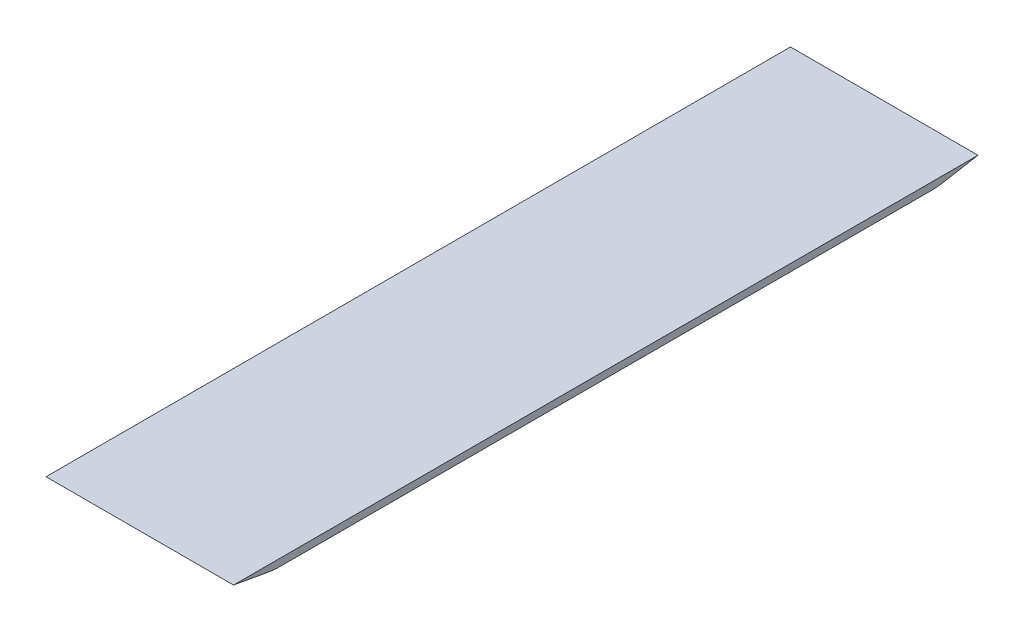
ISO-10303-21;
HEADER;
FILE_DESCRIPTION(('STEP AP214'),'2;1');
FILE_NAME('part.step','',(''),(''),'','','');
FILE_SCHEMA(('AUTOMOTIVE_DESIGN { 1 0 10303 214 1 1 1 1 }'));
ENDSEC;
DATA;
#1=APPLICATION_CONTEXT('core data for automotive mechanical design processes');
#2=APPLICATION_PROTOCOL_DEFINITION('international standard','automotive_design',2000,#1);
#3=PRODUCT_CONTEXT('',#1,'mechanical');
#4=PRODUCT('Part','Part','',(#3));
#5=PRODUCT_RELATED_PRODUCT_CATEGORY('part','',(#4));
#6=PRODUCT_DEFINITION_FORMATION('','',#4);
#7=PRODUCT_DEFINITION_CONTEXT('part definition',#1,'design');
#8=PRODUCT_DEFINITION('design','',#6,#7);
#9=PRODUCT_DEFINITION_SHAPE('','',#8);
#10=(LENGTH_UNIT() NAMED_UNIT(*) SI_UNIT(.MILLI.,.METRE.));
#11=(NAMED_UNIT(*) PLANE_ANGLE_UNIT() SI_UNIT($,.RADIAN.));
#12=(NAMED_UNIT(*) SI_UNIT($,.STERADIAN.) SOLID_ANGLE_UNIT());
#13=UNCERTAINTY_MEASURE_WITH_UNIT(LENGTH_MEASURE(1.E-05),#10,'distance_accuracy_value','');
#14=(GEOMETRIC_REPRESENTATION_CONTEXT(3) GLOBAL_UNCERTAINTY_ASSIGNED_CONTEXT((#13)) GLOBAL_UNIT_ASSIGNED_CONTEXT((#10,
#11,#12)) REPRESENTATION_CONTEXT('',''));
#15=CARTESIAN_POINT('',(0.,0.,0.));
#16=DIRECTION('',(0.,0.,1.));
#17=DIRECTION('',(1.,0.,0.));
#18=AXIS2_PLACEMENT_3D('',#15,#16,#17);
#19=CARTESIAN_POINT('',(130.,0.,0.));
#20=DIRECTION('',(0.,0.984427575508482,-0.175790638483658));
#21=DIRECTION('',(0.,0.175790638483658,0.984427575508482));
#22=AXIS2_PLACEMENT_3D('',#19,#20,#21);
#23=PLANE('',#22);
#24=DIRECTION('',(0.,-0.175790638483658,-0.984427575508482));
#25=VECTOR('',#24,1.);
#26=CARTESIAN_POINT('',(0.,0.,0.));
#27=LINE('',#26,#25);
#28=CARTESIAN_POINT('',(0.,0.,0.));
#29=VERTEX_POINT('',#28);
#30=CARTESIAN_POINT('',(0.,-4.22137877542409,-23.6397211423749));
#31=VERTEX_POINT('',#30);
#32=EDGE_CURVE('E121',#29,#31,#27,.T.);
#33=ORIENTED_EDGE('',*,*,#32,.T.);
#34=DIRECTION('',(-1.,0.,0.));
#35=VECTOR('',#34,1.);
#36=CARTESIAN_POINT('',(130.,-4.22137877542409,-23.6397211423749));
#37=LINE('',#36,#35);
#38=CARTESIAN_POINT('',(130.,-4.22137877542409,-23.6397211423749));
#39=VERTEX_POINT('',#38);
#40=EDGE_CURVE('E11',#31,#39,#37,.F.);
#41=ORIENTED_EDGE('',*,*,#40,.T.);
#42=DIRECTION('',(0.,-0.175790638483658,-0.984427575508482));
#43=VECTOR('',#42,1.);
#44=CARTESIAN_POINT('',(130.,0.,0.));
#45=LINE('',#44,#43);
#46=CARTESIAN_POINT('',(130.,0.,0.));
#47=VERTEX_POINT('',#46);
#48=EDGE_CURVE('E127',#47,#39,#45,.T.);
#49=ORIENTED_EDGE('',*,*,#48,.F.);
#50=DIRECTION('',(-1.,0.,0.));
#51=VECTOR('',#50,1.);
#52=CARTESIAN_POINT('',(130.,0.,0.));
#53=LINE('',#52,#51);
#54=EDGE_CURVE('E114',#47,#29,#53,.T.);
#55=ORIENTED_EDGE('',*,*,#54,.T.);
#56=EDGE_LOOP('',(#33,#41,#49,#55));
#57=FACE_BOUND('',#56,.T.);
#58=ADVANCED_FACE('F39',(#57),#23,.F.);
#59=CARTESIAN_POINT('',(130.,-5.,-28.));
#60=DIRECTION('',(0.,1.,0.));
#61=DIRECTION('',(0.,0.,1.));
#62=AXIS2_PLACEMENT_3D('',#59,#60,#61);
#63=PLANE('',#62);
#64=DIRECTION('',(0.,0.,-1.));
#65=VECTOR('',#64,1.);
#66=CARTESIAN_POINT('',(0.,-5.,-28.));
#67=LINE('',#66,#65);
#68=CARTESIAN_POINT('',(0.,-5.,-32.4292530665578));
#69=VERTEX_POINT('',#68);
#70=CARTESIAN_POINT('',(0.,-5.,-483.570746933442));
#71=VERTEX_POINT('',#70);
#72=EDGE_CURVE('E123',#69,#71,#67,.T.);
#73=ORIENTED_EDGE('',*,*,#72,.T.);
#74=DIRECTION('',(-1.,0.,0.));
#75=VECTOR('',#74,1.);
#76=CARTESIAN_POINT('',(130.,-5.,-483.570746933442));
#77=LINE('',#76,#75);
#78=CARTESIAN_POINT('',(130.,-5.,-483.570746933442));
#79=VERTEX_POINT('',#78);
#80=EDGE_CURVE('E60',#71,#79,#77,.F.);
#81=ORIENTED_EDGE('',*,*,#80,.T.);
#82=DIRECTION('',(0.,0.,-1.));
#83=VECTOR('',#82,1.);
#84=CARTESIAN_POINT('',(130.,-5.,-28.));
#85=LINE('',#84,#83);
#86=CARTESIAN_POINT('',(130.,-5.,-32.4292530665578));
#87=VERTEX_POINT('',#86);
#88=EDGE_CURVE('E103',#87,#79,#85,.T.);
#89=ORIENTED_EDGE('',*,*,#88,.F.);
#90=DIRECTION('',(-1.,0.,0.));
#91=VECTOR('',#90,1.);
#92=CARTESIAN_POINT('',(130.,-5.,-32.4292530665578));
#93=LINE('',#92,#91);
#94=EDGE_CURVE('E134',#87,#69,#93,.T.);
#95=ORIENTED_EDGE('',*,*,#94,.T.);
#96=EDGE_LOOP('',(#73,#81,#89,#95));
#97=FACE_BOUND('',#96,.T.);
#98=ADVANCED_FACE('F142',(#97),#63,.F.);
#99=CARTESIAN_POINT('',(130.,-5.,-488.));
#100=DIRECTION('',(0.,0.984427575508482,0.175790638483658));
#101=DIRECTION('',(0.,-0.175790638483658,0.984427575508482));
#102=AXIS2_PLACEMENT_3D('',#99,#100,#101);
#103=PLANE('',#102);
#104=DIRECTION('',(0.,0.175790638483658,-0.984427575508482));
#105=VECTOR('',#104,1.);
#106=CARTESIAN_POINT('',(130.,-5.,-488.));
#107=LINE('',#106,#105);
#108=CARTESIAN_POINT('',(130.,-4.22137877542409,-492.360278857625));
#109=VERTEX_POINT('',#108);
#110=CARTESIAN_POINT('',(130.,0.,-516.));
#111=VERTEX_POINT('',#110);
#112=EDGE_CURVE('E94',#109,#111,#107,.T.);
#113=ORIENTED_EDGE('',*,*,#112,.F.);
#114=DIRECTION('',(-1.,0.,0.));
#115=VECTOR('',#114,1.);
#116=CARTESIAN_POINT('',(130.,-4.22137877542409,-492.360278857625));
#117=LINE('',#116,#115);
#118=CARTESIAN_POINT('',(0.,-4.22137877542409,-492.360278857625));
#119=VERTEX_POINT('',#118);
#120=EDGE_CURVE('E113',#109,#119,#117,.T.);
#121=ORIENTED_EDGE('',*,*,#120,.T.);
#122=DIRECTION('',(0.,0.175790638483658,-0.984427575508482));
#123=VECTOR('',#122,1.);
#124=CARTESIAN_POINT('',(0.,-5.,-488.));
#125=LINE('',#124,#123);
#126=CARTESIAN_POINT('',(0.,0.,-516.));
#127=VERTEX_POINT('',#126);
#128=EDGE_CURVE('E109',#119,#127,#125,.T.);
#129=ORIENTED_EDGE('',*,*,#128,.T.);
#130=DIRECTION('',(-1.,0.,0.));
#131=VECTOR('',#130,1.);
#132=CARTESIAN_POINT('',(130.,0.,-516.));
#133=LINE('',#132,#131);
#134=EDGE_CURVE('E106',#111,#127,#133,.T.);
#135=ORIENTED_EDGE('',*,*,#134,.F.);
#136=EDGE_LOOP('',(#113,#121,#129,#135));
#137=FACE_BOUND('',#136,.T.);
#138=ADVANCED_FACE('F107',(#137),#103,.F.);
#139=CARTESIAN_POINT('',(130.,0.,0.));
#140=DIRECTION('',(0.,1.,0.));
#141=DIRECTION('',(0.,0.,1.));
#142=AXIS2_PLACEMENT_3D('',#139,#140,#141);
#143=PLANE('',#142);
#144=DIRECTION('',(0.,0.,-1.));
#145=VECTOR('',#144,1.);
#146=CARTESIAN_POINT('',(0.,0.,0.));
#147=LINE('',#146,#145);
#148=EDGE_CURVE('E126',#29,#127,#147,.T.);
#149=ORIENTED_EDGE('',*,*,#148,.F.);
#150=ORIENTED_EDGE('',*,*,#54,.F.);
#151=DIRECTION('',(0.,0.,-1.));
#152=VECTOR('',#151,1.);
#153=CARTESIAN_POINT('',(130.,0.,0.));
#154=LINE('',#153,#152);
#155=EDGE_CURVE('E98',#47,#111,#154,.T.);
#156=ORIENTED_EDGE('',*,*,#155,.T.);
#157=ORIENTED_EDGE('',*,*,#134,.T.);
#158=EDGE_LOOP('',(#149,#150,#156,#157));
#159=FACE_BOUND('',#158,.T.);
#160=ADVANCED_FACE('F116',(#159),#143,.T.);
#161=CARTESIAN_POINT('',(130.,0.,0.));
#162=DIRECTION('',(1.,0.,0.));
#163=DIRECTION('',(0.,0.,-1.));
#164=AXIS2_PLACEMENT_3D('',#161,#162,#163);
#165=PLANE('',#164);
#166=ORIENTED_EDGE('',*,*,#88,.T.);
#167=CARTESIAN_POINT('',(130.,45.,-483.570746933442));
#168=DIRECTION('',(1.,0.,0.));
#169=DIRECTION('',(0.,0.,-1.));
#170=AXIS2_PLACEMENT_3D('',#167,#168,#169);
#171=CIRCLE('',#170,50.);
#172=EDGE_CURVE('E47',#79,#109,#171,.T.);
#173=ORIENTED_EDGE('',*,*,#172,.T.);
#174=ORIENTED_EDGE('',*,*,#112,.T.);
#175=ORIENTED_EDGE('',*,*,#155,.F.);
#176=ORIENTED_EDGE('',*,*,#48,.T.);
#177=CARTESIAN_POINT('',(130.,45.,-32.4292530665578));
#178=DIRECTION('',(1.,0.,0.));
#179=DIRECTION('',(0.,0.,-1.));
#180=AXIS2_PLACEMENT_3D('',#177,#178,#179);
#181=CIRCLE('',#180,50.);
#182=EDGE_CURVE('E138',#39,#87,#181,.T.);
#183=ORIENTED_EDGE('',*,*,#182,.T.);
#184=EDGE_LOOP('',(#166,#173,#174,#175,#176,#183));
#185=FACE_BOUND('',#184,.T.);
#186=ADVANCED_FACE('F96',(#185),#165,.T.);
#187=CARTESIAN_POINT('',(0.,0.,0.));
#188=DIRECTION('',(1.,0.,0.));
#189=DIRECTION('',(0.,0.,-1.));
#190=AXIS2_PLACEMENT_3D('',#187,#188,#189);
#191=PLANE('',#190);
#192=ORIENTED_EDGE('',*,*,#128,.F.);
#193=CARTESIAN_POINT('',(0.,45.,-483.570746933442));
#194=DIRECTION('',(1.,0.,0.));
#195=DIRECTION('',(0.,0.,-1.));
#196=AXIS2_PLACEMENT_3D('',#193,#194,#195);
#197=CIRCLE('',#196,50.);
#198=EDGE_CURVE('E132',#119,#71,#197,.F.);
#199=ORIENTED_EDGE('',*,*,#198,.T.);
#200=ORIENTED_EDGE('',*,*,#72,.F.);
#201=CARTESIAN_POINT('',(0.,45.,-32.4292530665578));
#202=DIRECTION('',(1.,0.,0.));
#203=DIRECTION('',(0.,0.,-1.));
#204=AXIS2_PLACEMENT_3D('',#201,#202,#203);
#205=CIRCLE('',#204,50.);
#206=EDGE_CURVE('E130',#69,#31,#205,.F.);
#207=ORIENTED_EDGE('',*,*,#206,.T.);
#208=ORIENTED_EDGE('',*,*,#32,.F.);
#209=ORIENTED_EDGE('',*,*,#148,.T.);
#210=EDGE_LOOP('',(#192,#199,#200,#207,#208,#209));
#211=FACE_BOUND('',#210,.T.);
#212=ADVANCED_FACE('F146',(#211),#191,.F.);
#213=CARTESIAN_POINT('',(130.,45.,-483.570746933442));
#214=DIRECTION('',(-1.,0.,0.));
#215=DIRECTION('',(0.,0.,1.));
#216=AXIS2_PLACEMENT_3D('',#213,#214,#215);
#217=CYLINDRICAL_SURFACE('',#216,50.);
#218=ORIENTED_EDGE('',*,*,#172,.F.);
#219=ORIENTED_EDGE('',*,*,#80,.F.);
#220=ORIENTED_EDGE('',*,*,#198,.F.);
#221=ORIENTED_EDGE('',*,*,#120,.F.);
#222=EDGE_LOOP('',(#218,#219,#220,#221));
#223=FACE_BOUND('',#222,.T.);
#224=ADVANCED_FACE('F156',(#223),#217,.T.);
#225=CARTESIAN_POINT('',(130.,45.,-32.4292530665578));
#226=DIRECTION('',(-1.,0.,0.));
#227=DIRECTION('',(0.,0.,1.));
#228=AXIS2_PLACEMENT_3D('',#225,#226,#227);
#229=CYLINDRICAL_SURFACE('',#228,50.);
#230=ORIENTED_EDGE('',*,*,#182,.F.);
#231=ORIENTED_EDGE('',*,*,#40,.F.);
#232=ORIENTED_EDGE('',*,*,#206,.F.);
#233=ORIENTED_EDGE('',*,*,#94,.F.);
#234=EDGE_LOOP('',(#230,#231,#232,#233));
#235=FACE_BOUND('',#234,.T.);
#236=ADVANCED_FACE('F41',(#235),#229,.T.);
#237=CLOSED_SHELL('',(#58,#98,#138,#160,#186,#212,#224,#236));
#238=MANIFOLD_SOLID_BREP('B2',#237);
#239=ADVANCED_BREP_SHAPE_REPRESENTATION('',(#18,#238),#14);
#240=SHAPE_DEFINITION_REPRESENTATION(#9,#239);
ENDSEC;
END-ISO-10303-21;
